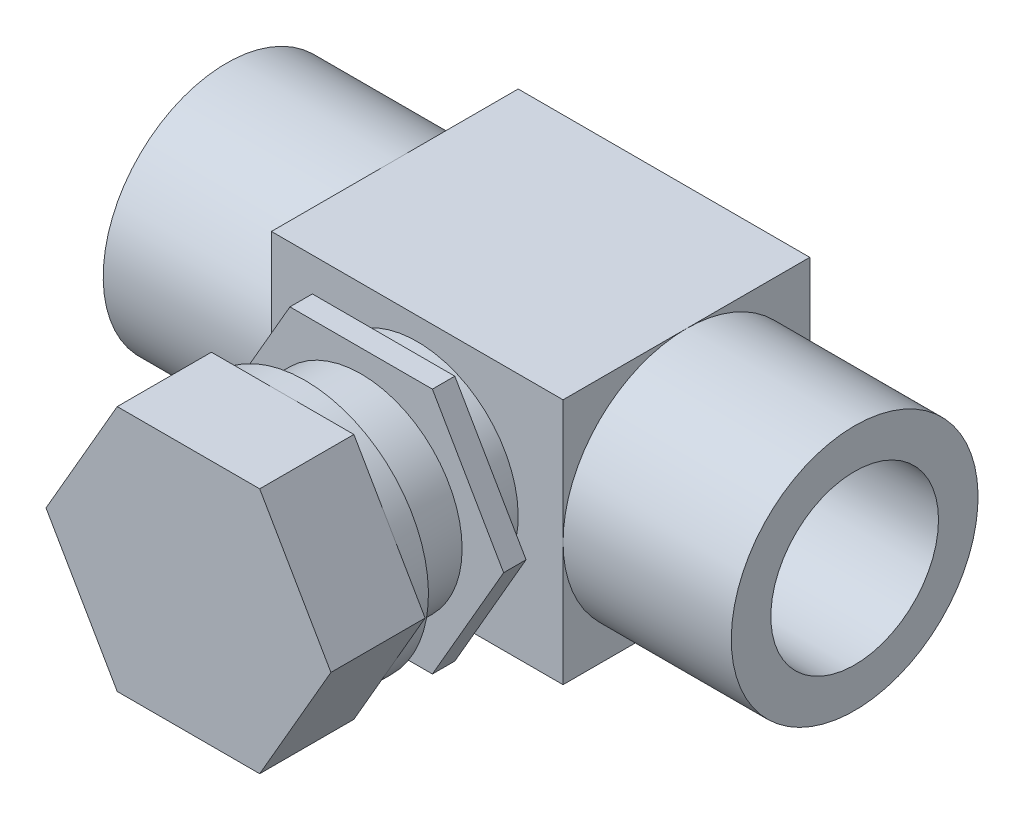
ISO-10303-21;
HEADER;
FILE_DESCRIPTION(('STEP AP214'),'2;1');
FILE_NAME('part.step','',(''),(''),'','','');
FILE_SCHEMA(('AUTOMOTIVE_DESIGN { 1 0 10303 214 1 1 1 1 }'));
ENDSEC;
DATA;
#1=APPLICATION_CONTEXT('core data for automotive mechanical design processes');
#2=APPLICATION_PROTOCOL_DEFINITION('international standard','automotive_design',2000,#1);
#3=PRODUCT_CONTEXT('',#1,'mechanical');
#4=PRODUCT('Part','Part','',(#3));
#5=PRODUCT_RELATED_PRODUCT_CATEGORY('part','',(#4));
#6=PRODUCT_DEFINITION_FORMATION('','',#4);
#7=PRODUCT_DEFINITION_CONTEXT('part definition',#1,'design');
#8=PRODUCT_DEFINITION('design','',#6,#7);
#9=PRODUCT_DEFINITION_SHAPE('','',#8);
#10=(LENGTH_UNIT() NAMED_UNIT(*) SI_UNIT(.MILLI.,.METRE.));
#11=(NAMED_UNIT(*) PLANE_ANGLE_UNIT() SI_UNIT($,.RADIAN.));
#12=(NAMED_UNIT(*) SI_UNIT($,.STERADIAN.) SOLID_ANGLE_UNIT());
#13=UNCERTAINTY_MEASURE_WITH_UNIT(LENGTH_MEASURE(1.E-05),#10,'distance_accuracy_value','');
#14=(GEOMETRIC_REPRESENTATION_CONTEXT(3) GLOBAL_UNCERTAINTY_ASSIGNED_CONTEXT((#13)) GLOBAL_UNIT_ASSIGNED_CONTEXT((#10,
#11,#12)) REPRESENTATION_CONTEXT('',''));
#15=CARTESIAN_POINT('',(0.,0.,0.));
#16=DIRECTION('',(0.,0.,1.));
#17=DIRECTION('',(1.,0.,0.));
#18=AXIS2_PLACEMENT_3D('',#15,#16,#17);
#19=CARTESIAN_POINT('',(241.042031682363,87.6716742459518,164.819588846238));
#20=DIRECTION('',(0.,0.,1.));
#21=DIRECTION('',(0.,1.,0.));
#22=AXIS2_PLACEMENT_3D('',#19,#20,#21);
#23=PLANE('',#22);
#24=CARTESIAN_POINT('',(247.392884643449,98.6716742459518,164.819588846238));
#25=DIRECTION('',(0.,0.,1.));
#26=DIRECTION('',(0.,1.,0.));
#27=AXIS2_PLACEMENT_3D('',#24,#25,#26);
#28=CIRCLE('',#27,9.);
#29=CARTESIAN_POINT('',(247.392884643449,107.671674245952,164.819588846238));
#30=VERTEX_POINT('',#29);
#31=EDGE_CURVE('E69',#30,#30,#28,.F.);
#32=ORIENTED_EDGE('',*,*,#31,.T.);
#33=EDGE_LOOP('',(#32));
#34=FACE_BOUND('',#33,.T.);
#35=DIRECTION('',(-0.5,-0.86602540378444,0.));
#36=VECTOR('',#35,1.);
#37=CARTESIAN_POINT('',(241.042031682363,109.671674245952,164.819588846238));
#38=LINE('',#37,#36);
#39=CARTESIAN_POINT('',(241.042031682363,109.671674245952,164.819588846238));
#40=VERTEX_POINT('',#39);
#41=CARTESIAN_POINT('',(234.691178721277,98.6716742459517,164.819588846238));
#42=VERTEX_POINT('',#41);
#43=EDGE_CURVE('E260',#40,#42,#38,.T.);
#44=ORIENTED_EDGE('',*,*,#43,.T.);
#45=DIRECTION('',(0.5,-0.866025403784438,0.));
#46=VECTOR('',#45,1.);
#47=CARTESIAN_POINT('',(234.691178721277,98.6716742459517,164.819588846238));
#48=LINE('',#47,#46);
#49=CARTESIAN_POINT('',(241.042031682363,87.6716742459518,164.819588846238));
#50=VERTEX_POINT('',#49);
#51=EDGE_CURVE('E262',#42,#50,#48,.T.);
#52=ORIENTED_EDGE('',*,*,#51,.T.);
#53=DIRECTION('',(1.,0.,0.));
#54=VECTOR('',#53,1.);
#55=CARTESIAN_POINT('',(241.042031682363,87.6716742459518,164.819588846238));
#56=LINE('',#55,#54);
#57=CARTESIAN_POINT('',(253.743737604535,87.6716742459518,164.819588846239));
#58=VERTEX_POINT('',#57);
#59=EDGE_CURVE('E251',#50,#58,#56,.T.);
#60=ORIENTED_EDGE('',*,*,#59,.T.);
#61=DIRECTION('',(0.5,0.866025403784439,0.));
#62=VECTOR('',#61,1.);
#63=CARTESIAN_POINT('',(253.743737604535,87.6716742459518,164.819588846239));
#64=LINE('',#63,#62);
#65=CARTESIAN_POINT('',(260.09459056562,98.6716742459518,164.819588846238));
#66=VERTEX_POINT('',#65);
#67=EDGE_CURVE('E253',#58,#66,#64,.T.);
#68=ORIENTED_EDGE('',*,*,#67,.T.);
#69=DIRECTION('',(-0.5,0.866025403784438,0.));
#70=VECTOR('',#69,1.);
#71=CARTESIAN_POINT('',(260.09459056562,98.6716742459518,164.819588846238));
#72=LINE('',#71,#70);
#73=CARTESIAN_POINT('',(253.743737604535,109.671674245952,164.819588846238));
#74=VERTEX_POINT('',#73);
#75=EDGE_CURVE('E256',#66,#74,#72,.T.);
#76=ORIENTED_EDGE('',*,*,#75,.T.);
#77=DIRECTION('',(-1.,0.,0.));
#78=VECTOR('',#77,1.);
#79=CARTESIAN_POINT('',(253.743737604535,109.671674245952,164.819588846238));
#80=LINE('',#79,#78);
#81=EDGE_CURVE('E258',#74,#40,#80,.T.);
#82=ORIENTED_EDGE('',*,*,#81,.T.);
#83=EDGE_LOOP('',(#44,#52,#60,#68,#76,#82));
#84=FACE_BOUND('',#83,.T.);
#85=ADVANCED_FACE('F61',(#34,#84),#23,.T.);
#86=CARTESIAN_POINT('',(234.392884643449,87.6716742459516,137.819588846238));
#87=DIRECTION('',(-1.,0.,0.));
#88=DIRECTION('',(0.,0.,1.));
#89=AXIS2_PLACEMENT_3D('',#86,#87,#88);
#90=PLANE('',#89);
#91=DIRECTION('',(0.,0.,-1.));
#92=VECTOR('',#91,1.);
#93=CARTESIAN_POINT('',(234.392884643449,109.671674245952,159.819588846238));
#94=LINE('',#93,#92);
#95=CARTESIAN_POINT('',(234.392884643449,109.671674245952,159.819588846238));
#96=VERTEX_POINT('',#95);
#97=CARTESIAN_POINT('',(234.392884643449,109.671674245952,148.819588846238));
#98=VERTEX_POINT('',#97);
#99=EDGE_CURVE('E320',#96,#98,#94,.T.);
#100=ORIENTED_EDGE('',*,*,#99,.T.);
#101=CARTESIAN_POINT('',(234.392884643449,98.6716742459517,148.819588846238));
#102=DIRECTION('',(1.,0.,0.));
#103=DIRECTION('',(0.,1.,0.));
#104=AXIS2_PLACEMENT_3D('',#101,#102,#103);
#105=CIRCLE('',#104,11.);
#106=CARTESIAN_POINT('',(234.392884643449,98.6716742459517,159.819588846238));
#107=VERTEX_POINT('',#106);
#108=EDGE_CURVE('E304',#98,#107,#105,.T.);
#109=ORIENTED_EDGE('',*,*,#108,.T.);
#110=DIRECTION('',(0.,1.,0.));
#111=VECTOR('',#110,1.);
#112=CARTESIAN_POINT('',(234.392884643449,87.6716742459517,159.819588846238));
#113=LINE('',#112,#111);
#114=EDGE_CURVE('E314',#107,#96,#113,.T.);
#115=ORIENTED_EDGE('',*,*,#114,.T.);
#116=EDGE_LOOP('',(#100,#109,#115));
#117=FACE_BOUND('',#116,.T.);
#118=ADVANCED_FACE('F411',(#117),#90,.T.);
#119=CARTESIAN_POINT('',(234.392884643449,87.6716742459517,159.819588846238));
#120=VERTEX_POINT('',#119);
#121=EDGE_CURVE('E316',#120,#107,#113,.T.);
#122=ORIENTED_EDGE('',*,*,#121,.T.);
#123=CARTESIAN_POINT('',(234.392884643449,87.6716742459517,148.819588846238));
#124=VERTEX_POINT('',#123);
#125=EDGE_CURVE('E309',#107,#124,#105,.T.);
#126=ORIENTED_EDGE('',*,*,#125,.T.);
#127=DIRECTION('',(0.,0.,1.));
#128=VECTOR('',#127,1.);
#129=CARTESIAN_POINT('',(234.392884643449,87.6716742459516,137.819588846238));
#130=LINE('',#129,#128);
#131=EDGE_CURVE('E315',#124,#120,#130,.T.);
#132=ORIENTED_EDGE('',*,*,#131,.T.);
#133=EDGE_LOOP('',(#122,#126,#132));
#134=FACE_BOUND('',#133,.T.);
#135=ADVANCED_FACE('F417',(#134),#90,.T.);
#136=CARTESIAN_POINT('',(234.392884643449,87.6716742459516,137.819588846238));
#137=VERTEX_POINT('',#136);
#138=EDGE_CURVE('E311',#137,#124,#130,.T.);
#139=ORIENTED_EDGE('',*,*,#138,.T.);
#140=CARTESIAN_POINT('',(234.392884643449,98.6716742459516,137.819588846238));
#141=VERTEX_POINT('',#140);
#142=EDGE_CURVE('E1294',#124,#141,#105,.T.);
#143=ORIENTED_EDGE('',*,*,#142,.T.);
#144=DIRECTION('',(0.,-1.,0.));
#145=VECTOR('',#144,1.);
#146=CARTESIAN_POINT('',(234.392884643449,109.671674245952,137.819588846238));
#147=LINE('',#146,#145);
#148=EDGE_CURVE('E323',#141,#137,#147,.T.);
#149=ORIENTED_EDGE('',*,*,#148,.T.);
#150=EDGE_LOOP('',(#139,#143,#149));
#151=FACE_BOUND('',#150,.T.);
#152=ADVANCED_FACE('F804',(#151),#90,.T.);
#153=CARTESIAN_POINT('',(234.392884643449,109.671674245952,137.819588846238));
#154=VERTEX_POINT('',#153);
#155=EDGE_CURVE('E324',#154,#141,#147,.T.);
#156=ORIENTED_EDGE('',*,*,#155,.T.);
#157=EDGE_CURVE('E310',#141,#98,#105,.T.);
#158=ORIENTED_EDGE('',*,*,#157,.T.);
#159=EDGE_CURVE('E319',#98,#154,#94,.T.);
#160=ORIENTED_EDGE('',*,*,#159,.T.);
#161=EDGE_LOOP('',(#156,#158,#160));
#162=FACE_BOUND('',#161,.T.);
#163=ADVANCED_FACE('F420',(#162),#90,.T.);
#164=CARTESIAN_POINT('',(260.392884643449,98.6716742459517,148.819588846238));
#165=DIRECTION('',(1.,0.,0.));
#166=DIRECTION('',(0.,0.,-1.));
#167=AXIS2_PLACEMENT_3D('',#164,#165,#166);
#168=CYLINDRICAL_SURFACE('',#167,11.);
#169=CARTESIAN_POINT('',(260.392884643449,98.6716742459517,148.819588846238));
#170=DIRECTION('',(1.,0.,0.));
#171=DIRECTION('',(0.,1.,0.));
#172=AXIS2_PLACEMENT_3D('',#169,#170,#171);
#173=CIRCLE('',#172,11.);
#174=CARTESIAN_POINT('',(260.392884643449,109.671674245952,148.819588846238));
#175=VERTEX_POINT('',#174);
#176=CARTESIAN_POINT('',(260.392884643449,98.6716742459517,159.819588846238));
#177=VERTEX_POINT('',#176);
#178=EDGE_CURVE('E356',#175,#177,#173,.T.);
#179=ORIENTED_EDGE('',*,*,#178,.T.);
#180=CARTESIAN_POINT('',(260.392884643449,87.6716742459517,148.819588846239));
#181=VERTEX_POINT('',#180);
#182=EDGE_CURVE('E359',#177,#181,#173,.T.);
#183=ORIENTED_EDGE('',*,*,#182,.T.);
#184=CARTESIAN_POINT('',(260.392884643449,98.6716742459516,137.819588846238));
#185=VERTEX_POINT('',#184);
#186=EDGE_CURVE('E1437',#181,#185,#173,.T.);
#187=ORIENTED_EDGE('',*,*,#186,.T.);
#188=EDGE_CURVE('E360',#185,#175,#173,.T.);
#189=ORIENTED_EDGE('',*,*,#188,.T.);
#190=EDGE_LOOP('',(#179,#183,#187,#189));
#191=FACE_BOUND('',#190,.T.);
#192=CARTESIAN_POINT('',(275.392884643449,98.6716742459517,148.819588846239));
#193=DIRECTION('',(1.,0.,0.));
#194=DIRECTION('',(0.,1.,0.));
#195=AXIS2_PLACEMENT_3D('',#192,#193,#194);
#196=CIRCLE('',#195,11.);
#197=CARTESIAN_POINT('',(275.392884643449,109.671674245952,148.819588846239));
#198=VERTEX_POINT('',#197);
#199=EDGE_CURVE('E355',#198,#198,#196,.T.);
#200=ORIENTED_EDGE('',*,*,#199,.F.);
#201=EDGE_LOOP('',(#200));
#202=FACE_BOUND('',#201,.T.);
#203=ADVANCED_FACE('F471',(#191,#202),#168,.T.);
#204=CARTESIAN_POINT('',(275.392884643449,98.6716742459517,148.819588846239));
#205=DIRECTION('',(1.,0.,0.));
#206=DIRECTION('',(0.,0.,-1.));
#207=AXIS2_PLACEMENT_3D('',#204,#205,#206);
#208=PLANE('',#207);
#209=CARTESIAN_POINT('',(275.392884643449,98.6716742459517,148.819588846239));
#210=DIRECTION('',(-1.,0.,0.));
#211=DIRECTION('',(0.,0.,-1.));
#212=AXIS2_PLACEMENT_3D('',#209,#210,#211);
#213=CIRCLE('',#212,7.475);
#214=CARTESIAN_POINT('',(275.392884643449,98.6716742459516,141.344588846239));
#215=VERTEX_POINT('',#214);
#216=EDGE_CURVE('E1422',#215,#215,#213,.T.);
#217=ORIENTED_EDGE('',*,*,#216,.T.);
#218=EDGE_LOOP('',(#217));
#219=FACE_BOUND('',#218,.T.);
#220=ORIENTED_EDGE('',*,*,#199,.T.);
#221=EDGE_LOOP('',(#220));
#222=FACE_BOUND('',#221,.T.);
#223=ADVANCED_FACE('F468',(#219,#222),#208,.T.);
#224=CARTESIAN_POINT('',(260.392884643449,87.6716742459516,137.819588846239));
#225=DIRECTION('',(-1.,0.,0.));
#226=DIRECTION('',(0.,0.,1.));
#227=AXIS2_PLACEMENT_3D('',#224,#225,#226);
#228=PLANE('',#227);
#229=ORIENTED_EDGE('',*,*,#178,.F.);
#230=DIRECTION('',(0.,0.,-1.));
#231=VECTOR('',#230,1.);
#232=CARTESIAN_POINT('',(260.392884643449,109.671674245952,148.819588846238));
#233=LINE('',#232,#231);
#234=CARTESIAN_POINT('',(260.392884643449,109.671674245952,159.819588846238));
#235=VERTEX_POINT('',#234);
#236=EDGE_CURVE('E338',#235,#175,#233,.T.);
#237=ORIENTED_EDGE('',*,*,#236,.F.);
#238=DIRECTION('',(0.,1.,0.));
#239=VECTOR('',#238,1.);
#240=CARTESIAN_POINT('',(260.392884643449,98.6716742459517,159.819588846238));
#241=LINE('',#240,#239);
#242=EDGE_CURVE('E332',#177,#235,#241,.T.);
#243=ORIENTED_EDGE('',*,*,#242,.F.);
#244=EDGE_LOOP('',(#229,#237,#243));
#245=FACE_BOUND('',#244,.T.);
#246=ADVANCED_FACE('F451',(#245),#228,.F.);
#247=ORIENTED_EDGE('',*,*,#182,.F.);
#248=CARTESIAN_POINT('',(260.392884643449,87.6716742459517,159.819588846239));
#249=VERTEX_POINT('',#248);
#250=EDGE_CURVE('E333',#249,#177,#241,.T.);
#251=ORIENTED_EDGE('',*,*,#250,.F.);
#252=DIRECTION('',(0.,0.,1.));
#253=VECTOR('',#252,1.);
#254=CARTESIAN_POINT('',(260.392884643449,87.6716742459517,148.819588846239));
#255=LINE('',#254,#253);
#256=EDGE_CURVE('E303',#181,#249,#255,.T.);
#257=ORIENTED_EDGE('',*,*,#256,.F.);
#258=EDGE_LOOP('',(#247,#251,#257));
#259=FACE_BOUND('',#258,.T.);
#260=ADVANCED_FACE('F780',(#259),#228,.F.);
#261=ORIENTED_EDGE('',*,*,#186,.F.);
#262=CARTESIAN_POINT('',(260.392884643449,87.6716742459516,137.819588846239));
#263=VERTEX_POINT('',#262);
#264=EDGE_CURVE('E328',#263,#181,#255,.T.);
#265=ORIENTED_EDGE('',*,*,#264,.F.);
#266=DIRECTION('',(0.,-1.,0.));
#267=VECTOR('',#266,1.);
#268=CARTESIAN_POINT('',(260.392884643449,109.671674245952,137.819588846238));
#269=LINE('',#268,#267);
#270=EDGE_CURVE('E341',#185,#263,#269,.T.);
#271=ORIENTED_EDGE('',*,*,#270,.F.);
#272=EDGE_LOOP('',(#261,#265,#271));
#273=FACE_BOUND('',#272,.T.);
#274=ADVANCED_FACE('F452',(#273),#228,.F.);
#275=CARTESIAN_POINT('',(234.392884643449,87.6716742459517,148.819588846238));
#276=DIRECTION('',(0.,1.,0.));
#277=DIRECTION('',(0.,0.,-1.));
#278=AXIS2_PLACEMENT_3D('',#275,#276,#277);
#279=PLANE('',#278);
#280=ORIENTED_EDGE('',*,*,#264,.T.);
#281=ORIENTED_EDGE('',*,*,#256,.T.);
#282=DIRECTION('',(1.,0.,0.));
#283=VECTOR('',#282,1.);
#284=CARTESIAN_POINT('',(234.392884643449,87.6716742459517,159.819588846238));
#285=LINE('',#284,#283);
#286=EDGE_CURVE('E350',#120,#249,#285,.T.);
#287=ORIENTED_EDGE('',*,*,#286,.F.);
#288=ORIENTED_EDGE('',*,*,#131,.F.);
#289=ORIENTED_EDGE('',*,*,#138,.F.);
#290=DIRECTION('',(1.,0.,0.));
#291=VECTOR('',#290,1.);
#292=CARTESIAN_POINT('',(234.392884643449,87.6716742459516,137.819588846238));
#293=LINE('',#292,#291);
#294=EDGE_CURVE('E352',#137,#263,#293,.T.);
#295=ORIENTED_EDGE('',*,*,#294,.T.);
#296=EDGE_LOOP('',(#280,#281,#287,#288,#289,#295));
#297=FACE_BOUND('',#296,.T.);
#298=ADVANCED_FACE('F463',(#297),#279,.F.);
#299=CARTESIAN_POINT('',(234.392884643449,98.6716742459517,159.819588846238));
#300=DIRECTION('',(0.,0.,-1.));
#301=DIRECTION('',(0.,-1.,0.));
#302=AXIS2_PLACEMENT_3D('',#299,#300,#301);
#303=PLANE('',#302);
#304=CARTESIAN_POINT('',(247.392884643449,98.6716742459517,159.819588846238));
#305=DIRECTION('',(0.,0.,-1.));
#306=DIRECTION('',(0.,-1.,0.));
#307=AXIS2_PLACEMENT_3D('',#304,#305,#306);
#308=CIRCLE('',#307,9.);
#309=CARTESIAN_POINT('',(247.392884643449,89.6716742459517,159.819588846238));
#310=VERTEX_POINT('',#309);
#311=EDGE_CURVE('E299',#310,#310,#308,.T.);
#312=ORIENTED_EDGE('',*,*,#311,.T.);
#313=EDGE_LOOP('',(#312));
#314=FACE_BOUND('',#313,.T.);
#315=ORIENTED_EDGE('',*,*,#242,.T.);
#316=DIRECTION('',(1.,0.,0.));
#317=VECTOR('',#316,1.);
#318=CARTESIAN_POINT('',(234.392884643449,109.671674245952,159.819588846238));
#319=LINE('',#318,#317);
#320=EDGE_CURVE('E348',#96,#235,#319,.T.);
#321=ORIENTED_EDGE('',*,*,#320,.F.);
#322=ORIENTED_EDGE('',*,*,#114,.F.);
#323=ORIENTED_EDGE('',*,*,#121,.F.);
#324=ORIENTED_EDGE('',*,*,#286,.T.);
#325=ORIENTED_EDGE('',*,*,#250,.T.);
#326=EDGE_LOOP('',(#315,#321,#322,#323,#324,#325));
#327=FACE_BOUND('',#326,.T.);
#328=ADVANCED_FACE('F459',(#314,#327),#303,.F.);
#329=CARTESIAN_POINT('',(234.392884643449,109.671674245952,148.819588846238));
#330=DIRECTION('',(0.,-1.,0.));
#331=DIRECTION('',(0.,0.,1.));
#332=AXIS2_PLACEMENT_3D('',#329,#330,#331);
#333=PLANE('',#332);
#334=ORIENTED_EDGE('',*,*,#236,.T.);
#335=CARTESIAN_POINT('',(260.392884643449,109.671674245952,137.819588846238));
#336=VERTEX_POINT('',#335);
#337=EDGE_CURVE('E337',#175,#336,#233,.T.);
#338=ORIENTED_EDGE('',*,*,#337,.T.);
#339=DIRECTION('',(1.,0.,0.));
#340=VECTOR('',#339,1.);
#341=CARTESIAN_POINT('',(234.392884643449,109.671674245952,137.819588846238));
#342=LINE('',#341,#340);
#343=EDGE_CURVE('E327',#154,#336,#342,.T.);
#344=ORIENTED_EDGE('',*,*,#343,.F.);
#345=ORIENTED_EDGE('',*,*,#159,.F.);
#346=ORIENTED_EDGE('',*,*,#99,.F.);
#347=ORIENTED_EDGE('',*,*,#320,.T.);
#348=EDGE_LOOP('',(#334,#338,#344,#345,#346,#347));
#349=FACE_BOUND('',#348,.T.);
#350=ADVANCED_FACE('F455',(#349),#333,.F.);
#351=CARTESIAN_POINT('',(234.392884643449,109.671674245952,137.819588846238));
#352=DIRECTION('',(0.,0.,1.));
#353=DIRECTION('',(0.,1.,0.));
#354=AXIS2_PLACEMENT_3D('',#351,#352,#353);
#355=PLANE('',#354);
#356=EDGE_CURVE('E342',#336,#185,#269,.T.);
#357=ORIENTED_EDGE('',*,*,#356,.T.);
#358=ORIENTED_EDGE('',*,*,#270,.T.);
#359=ORIENTED_EDGE('',*,*,#294,.F.);
#360=ORIENTED_EDGE('',*,*,#148,.F.);
#361=ORIENTED_EDGE('',*,*,#155,.F.);
#362=ORIENTED_EDGE('',*,*,#343,.T.);
#363=EDGE_LOOP('',(#357,#358,#359,#360,#361,#362));
#364=FACE_BOUND('',#363,.T.);
#365=ADVANCED_FACE('F449',(#364),#355,.F.);
#366=ORIENTED_EDGE('',*,*,#188,.F.);
#367=ORIENTED_EDGE('',*,*,#356,.F.);
#368=ORIENTED_EDGE('',*,*,#337,.F.);
#369=EDGE_LOOP('',(#366,#367,#368));
#370=FACE_BOUND('',#369,.T.);
#371=ADVANCED_FACE('F444',(#370),#228,.F.);
#372=CARTESIAN_POINT('',(219.392884643449,98.6716742459517,148.819588846238));
#373=DIRECTION('',(1.,0.,0.));
#374=DIRECTION('',(0.,0.,-1.));
#375=AXIS2_PLACEMENT_3D('',#372,#373,#374);
#376=CYLINDRICAL_SURFACE('',#375,11.);
#377=ORIENTED_EDGE('',*,*,#108,.F.);
#378=ORIENTED_EDGE('',*,*,#157,.F.);
#379=ORIENTED_EDGE('',*,*,#142,.F.);
#380=ORIENTED_EDGE('',*,*,#125,.F.);
#381=EDGE_LOOP('',(#377,#378,#379,#380));
#382=FACE_BOUND('',#381,.T.);
#383=CARTESIAN_POINT('',(219.392884643449,98.6716742459517,148.819588846238));
#384=DIRECTION('',(1.,0.,0.));
#385=DIRECTION('',(0.,-1.,0.));
#386=AXIS2_PLACEMENT_3D('',#383,#384,#385);
#387=CIRCLE('',#386,11.);
#388=CARTESIAN_POINT('',(219.392884643449,87.6716742459517,148.819588846238));
#389=VERTEX_POINT('',#388);
#390=EDGE_CURVE('E300',#389,#389,#387,.T.);
#391=ORIENTED_EDGE('',*,*,#390,.T.);
#392=EDGE_LOOP('',(#391));
#393=FACE_BOUND('',#392,.T.);
#394=ADVANCED_FACE('F441',(#382,#393),#376,.T.);
#395=CARTESIAN_POINT('',(219.392884643449,98.6716742459517,148.819588846238));
#396=DIRECTION('',(1.,0.,0.));
#397=DIRECTION('',(0.,0.,-1.));
#398=AXIS2_PLACEMENT_3D('',#395,#396,#397);
#399=PLANE('',#398);
#400=CARTESIAN_POINT('',(219.392884643449,98.6716742459517,148.819588846238));
#401=DIRECTION('',(1.,0.,0.));
#402=DIRECTION('',(0.,0.,1.));
#403=AXIS2_PLACEMENT_3D('',#400,#401,#402);
#404=CIRCLE('',#403,7.475);
#405=CARTESIAN_POINT('',(219.392884643449,98.6716742459517,156.294588846238));
#406=VERTEX_POINT('',#405);
#407=EDGE_CURVE('E228',#406,#406,#404,.T.);
#408=ORIENTED_EDGE('',*,*,#407,.T.);
#409=EDGE_LOOP('',(#408));
#410=FACE_BOUND('',#409,.T.);
#411=ORIENTED_EDGE('',*,*,#390,.F.);
#412=EDGE_LOOP('',(#411));
#413=FACE_BOUND('',#412,.T.);
#414=ADVANCED_FACE('F438',(#410,#413),#399,.F.);
#415=CARTESIAN_POINT('',(247.392884643449,98.6716742459518,160.819588846238));
#416=DIRECTION('',(0.,0.,-1.));
#417=DIRECTION('',(0.,-1.,0.));
#418=AXIS2_PLACEMENT_3D('',#415,#416,#417);
#419=CYLINDRICAL_SURFACE('',#418,9.);
#420=ORIENTED_EDGE('',*,*,#311,.F.);
#421=EDGE_LOOP('',(#420));
#422=FACE_BOUND('',#421,.T.);
#423=CARTESIAN_POINT('',(247.392884643449,98.6716742459518,162.819588846238));
#424=DIRECTION('',(0.,0.,1.));
#425=DIRECTION('',(0.,1.,0.));
#426=AXIS2_PLACEMENT_3D('',#423,#424,#425);
#427=CIRCLE('',#426,9.);
#428=CARTESIAN_POINT('',(247.392884643449,107.671674245952,162.819588846238));
#429=VERTEX_POINT('',#428);
#430=EDGE_CURVE('E308',#429,#429,#427,.F.);
#431=ORIENTED_EDGE('',*,*,#430,.T.);
#432=EDGE_LOOP('',(#431));
#433=FACE_BOUND('',#432,.T.);
#434=ADVANCED_FACE('F63',(#422,#433),#419,.T.);
#435=CARTESIAN_POINT('',(241.042031682363,87.6716742459518,162.819588846238));
#436=DIRECTION('',(0.,0.,1.));
#437=DIRECTION('',(0.,1.,0.));
#438=AXIS2_PLACEMENT_3D('',#435,#436,#437);
#439=PLANE('',#438);
#440=ORIENTED_EDGE('',*,*,#430,.F.);
#441=EDGE_LOOP('',(#440));
#442=FACE_BOUND('',#441,.T.);
#443=DIRECTION('',(0.5,-0.866025403784438,0.));
#444=VECTOR('',#443,1.);
#445=CARTESIAN_POINT('',(234.691178721277,98.6716742459517,162.819588846238));
#446=LINE('',#445,#444);
#447=CARTESIAN_POINT('',(234.691178721277,98.6716742459517,162.819588846238));
#448=VERTEX_POINT('',#447);
#449=CARTESIAN_POINT('',(241.042031682363,87.6716742459518,162.819588846238));
#450=VERTEX_POINT('',#449);
#451=EDGE_CURVE('E254',#448,#450,#446,.T.);
#452=ORIENTED_EDGE('',*,*,#451,.F.);
#453=DIRECTION('',(-0.5,-0.866025403784439,0.));
#454=VECTOR('',#453,1.);
#455=CARTESIAN_POINT('',(237.86660520182,104.171674245952,162.819588846238));
#456=LINE('',#455,#454);
#457=CARTESIAN_POINT('',(241.042031682363,109.671674245952,162.819588846238));
#458=VERTEX_POINT('',#457);
#459=EDGE_CURVE('E277',#458,#448,#456,.T.);
#460=ORIENTED_EDGE('',*,*,#459,.F.);
#461=DIRECTION('',(-1.,0.,0.));
#462=VECTOR('',#461,1.);
#463=CARTESIAN_POINT('',(247.392884643449,109.671674245952,162.819588846238));
#464=LINE('',#463,#462);
#465=CARTESIAN_POINT('',(253.743737604535,109.671674245952,162.819588846238));
#466=VERTEX_POINT('',#465);
#467=EDGE_CURVE('E274',#466,#458,#464,.T.);
#468=ORIENTED_EDGE('',*,*,#467,.F.);
#469=DIRECTION('',(-0.5,0.866025403784438,0.));
#470=VECTOR('',#469,1.);
#471=CARTESIAN_POINT('',(256.919164085077,104.171674245952,162.819588846238));
#472=LINE('',#471,#470);
#473=CARTESIAN_POINT('',(260.09459056562,98.6716742459518,162.819588846238));
#474=VERTEX_POINT('',#473);
#475=EDGE_CURVE('E271',#474,#466,#472,.T.);
#476=ORIENTED_EDGE('',*,*,#475,.F.);
#477=DIRECTION('',(0.5,0.866025403784439,0.));
#478=VECTOR('',#477,1.);
#479=CARTESIAN_POINT('',(256.919164085077,93.1716742459518,162.819588846238));
#480=LINE('',#479,#478);
#481=CARTESIAN_POINT('',(253.743737604535,87.6716742459518,162.819588846239));
#482=VERTEX_POINT('',#481);
#483=EDGE_CURVE('E268',#482,#474,#480,.T.);
#484=ORIENTED_EDGE('',*,*,#483,.F.);
#485=DIRECTION('',(1.,0.,0.));
#486=VECTOR('',#485,1.);
#487=CARTESIAN_POINT('',(247.392884643449,87.6716742459518,162.819588846238));
#488=LINE('',#487,#486);
#489=EDGE_CURVE('E265',#450,#482,#488,.T.);
#490=ORIENTED_EDGE('',*,*,#489,.F.);
#491=EDGE_LOOP('',(#452,#460,#468,#476,#484,#490));
#492=FACE_BOUND('',#491,.T.);
#493=ADVANCED_FACE('F375',(#442,#492),#439,.F.);
#494=CARTESIAN_POINT('',(247.392884643449,87.6716742459518,164.819588846238));
#495=DIRECTION('',(0.,1.,0.));
#496=DIRECTION('',(-1.,0.,0.));
#497=AXIS2_PLACEMENT_3D('',#494,#495,#496);
#498=PLANE('',#497);
#499=ORIENTED_EDGE('',*,*,#489,.T.);
#500=DIRECTION('',(0.,0.,-1.));
#501=VECTOR('',#500,1.);
#502=CARTESIAN_POINT('',(253.743737604535,87.6716742459518,164.819588846239));
#503=LINE('',#502,#501);
#504=EDGE_CURVE('E293',#58,#482,#503,.T.);
#505=ORIENTED_EDGE('',*,*,#504,.F.);
#506=ORIENTED_EDGE('',*,*,#59,.F.);
#507=DIRECTION('',(0.,0.,-1.));
#508=VECTOR('',#507,1.);
#509=CARTESIAN_POINT('',(241.042031682363,87.6716742459518,164.819588846238));
#510=LINE('',#509,#508);
#511=EDGE_CURVE('E296',#50,#450,#510,.T.);
#512=ORIENTED_EDGE('',*,*,#511,.T.);
#513=EDGE_LOOP('',(#499,#505,#506,#512));
#514=FACE_BOUND('',#513,.T.);
#515=ADVANCED_FACE('F378',(#514),#498,.F.);
#516=CARTESIAN_POINT('',(256.919164085077,93.1716742459518,164.819588846238));
#517=DIRECTION('',(-0.866025403784439,0.5,0.));
#518=DIRECTION('',(-0.5,-0.866025403784439,0.));
#519=AXIS2_PLACEMENT_3D('',#516,#517,#518);
#520=PLANE('',#519);
#521=ORIENTED_EDGE('',*,*,#483,.T.);
#522=DIRECTION('',(0.,0.,-1.));
#523=VECTOR('',#522,1.);
#524=CARTESIAN_POINT('',(260.09459056562,98.6716742459518,164.819588846238));
#525=LINE('',#524,#523);
#526=EDGE_CURVE('E290',#66,#474,#525,.T.);
#527=ORIENTED_EDGE('',*,*,#526,.F.);
#528=ORIENTED_EDGE('',*,*,#67,.F.);
#529=ORIENTED_EDGE('',*,*,#504,.T.);
#530=EDGE_LOOP('',(#521,#527,#528,#529));
#531=FACE_BOUND('',#530,.T.);
#532=ADVANCED_FACE('F405',(#531),#520,.F.);
#533=CARTESIAN_POINT('',(256.919164085077,104.171674245952,164.819588846238));
#534=DIRECTION('',(-0.866025403784438,-0.5,0.));
#535=DIRECTION('',(0.5,-0.866025403784438,0.));
#536=AXIS2_PLACEMENT_3D('',#533,#534,#535);
#537=PLANE('',#536);
#538=ORIENTED_EDGE('',*,*,#475,.T.);
#539=DIRECTION('',(0.,0.,-1.));
#540=VECTOR('',#539,1.);
#541=CARTESIAN_POINT('',(253.743737604535,109.671674245952,164.819588846238));
#542=LINE('',#541,#540);
#543=EDGE_CURVE('E287',#74,#466,#542,.T.);
#544=ORIENTED_EDGE('',*,*,#543,.F.);
#545=ORIENTED_EDGE('',*,*,#75,.F.);
#546=ORIENTED_EDGE('',*,*,#526,.T.);
#547=EDGE_LOOP('',(#538,#544,#545,#546));
#548=FACE_BOUND('',#547,.T.);
#549=ADVANCED_FACE('F402',(#548),#537,.F.);
#550=CARTESIAN_POINT('',(247.392884643449,109.671674245952,164.819588846238));
#551=DIRECTION('',(0.,-1.,0.));
#552=DIRECTION('',(1.,0.,0.));
#553=AXIS2_PLACEMENT_3D('',#550,#551,#552);
#554=PLANE('',#553);
#555=ORIENTED_EDGE('',*,*,#467,.T.);
#556=DIRECTION('',(0.,0.,-1.));
#557=VECTOR('',#556,1.);
#558=CARTESIAN_POINT('',(241.042031682363,109.671674245952,164.819588846238));
#559=LINE('',#558,#557);
#560=EDGE_CURVE('E284',#40,#458,#559,.T.);
#561=ORIENTED_EDGE('',*,*,#560,.F.);
#562=ORIENTED_EDGE('',*,*,#81,.F.);
#563=ORIENTED_EDGE('',*,*,#543,.T.);
#564=EDGE_LOOP('',(#555,#561,#562,#563));
#565=FACE_BOUND('',#564,.T.);
#566=ADVANCED_FACE('F396',(#565),#554,.F.);
#567=CARTESIAN_POINT('',(237.86660520182,104.171674245952,164.819588846238));
#568=DIRECTION('',(0.866025403784439,-0.5,0.));
#569=DIRECTION('',(0.5,0.866025403784439,0.));
#570=AXIS2_PLACEMENT_3D('',#567,#568,#569);
#571=PLANE('',#570);
#572=ORIENTED_EDGE('',*,*,#459,.T.);
#573=DIRECTION('',(0.,0.,-1.));
#574=VECTOR('',#573,1.);
#575=CARTESIAN_POINT('',(234.691178721277,98.6716742459517,164.819588846238));
#576=LINE('',#575,#574);
#577=EDGE_CURVE('E264',#42,#448,#576,.T.);
#578=ORIENTED_EDGE('',*,*,#577,.F.);
#579=ORIENTED_EDGE('',*,*,#43,.F.);
#580=ORIENTED_EDGE('',*,*,#560,.T.);
#581=EDGE_LOOP('',(#572,#578,#579,#580));
#582=FACE_BOUND('',#581,.T.);
#583=ADVANCED_FACE('F392',(#582),#571,.F.);
#584=CARTESIAN_POINT('',(234.691178721277,98.6716742459517,164.819588846238));
#585=DIRECTION('',(0.866025403784438,0.5,0.));
#586=DIRECTION('',(-0.5,0.866025403784438,0.));
#587=AXIS2_PLACEMENT_3D('',#584,#585,#586);
#588=PLANE('',#587);
#589=ORIENTED_EDGE('',*,*,#451,.T.);
#590=ORIENTED_EDGE('',*,*,#511,.F.);
#591=ORIENTED_EDGE('',*,*,#51,.F.);
#592=ORIENTED_EDGE('',*,*,#577,.T.);
#593=EDGE_LOOP('',(#589,#590,#591,#592));
#594=FACE_BOUND('',#593,.T.);
#595=ADVANCED_FACE('F387',(#594),#588,.F.);
#596=CARTESIAN_POINT('',(247.392884643449,98.6716742459519,169.819588846238));
#597=DIRECTION('',(0.,0.,-1.));
#598=DIRECTION('',(0.,-1.,0.));
#599=AXIS2_PLACEMENT_3D('',#596,#597,#598);
#600=CYLINDRICAL_SURFACE('',#599,9.);
#601=ORIENTED_EDGE('',*,*,#31,.F.);
#602=EDGE_LOOP('',(#601));
#603=FACE_BOUND('',#602,.T.);
#604=CARTESIAN_POINT('',(247.392884643449,98.6716742459519,169.819588846238));
#605=DIRECTION('',(0.,0.,-1.));
#606=DIRECTION('',(0.,-1.,0.));
#607=AXIS2_PLACEMENT_3D('',#604,#605,#606);
#608=CIRCLE('',#607,9.);
#609=CARTESIAN_POINT('',(247.392884643449,89.6716742459519,169.819588846238));
#610=VERTEX_POINT('',#609);
#611=EDGE_CURVE('E248',#610,#610,#608,.F.);
#612=ORIENTED_EDGE('',*,*,#611,.F.);
#613=EDGE_LOOP('',(#612));
#614=FACE_BOUND('',#613,.T.);
#615=ADVANCED_FACE('F427',(#603,#614),#600,.T.);
#616=CARTESIAN_POINT('',(247.392884643449,98.6716742459519,171.819588846238));
#617=DIRECTION('',(0.,0.,-1.));
#618=DIRECTION('',(0.,-1.,0.));
#619=AXIS2_PLACEMENT_3D('',#616,#617,#618);
#620=CYLINDRICAL_SURFACE('',#619,11.);
#621=CARTESIAN_POINT('',(247.392884643449,98.6716742459519,171.819588846238));
#622=DIRECTION('',(0.,0.,-1.));
#623=DIRECTION('',(0.,1.,0.));
#624=AXIS2_PLACEMENT_3D('',#621,#622,#623);
#625=CIRCLE('',#624,11.);
#626=CARTESIAN_POINT('',(247.392884643449,109.671674245952,171.819588846238));
#627=VERTEX_POINT('',#626);
#628=CARTESIAN_POINT('',(256.919164085077,104.171674245952,171.819588846238));
#629=VERTEX_POINT('',#628);
#630=EDGE_CURVE('E246',#627,#629,#625,.T.);
#631=ORIENTED_EDGE('',*,*,#630,.T.);
#632=CARTESIAN_POINT('',(256.919164085077,93.1716742459518,171.819588846239));
#633=VERTEX_POINT('',#632);
#634=EDGE_CURVE('E249',#629,#633,#625,.T.);
#635=ORIENTED_EDGE('',*,*,#634,.T.);
#636=CARTESIAN_POINT('',(247.392884643449,87.6716742459518,171.819588846238));
#637=VERTEX_POINT('',#636);
#638=EDGE_CURVE('E1403',#633,#637,#625,.T.);
#639=ORIENTED_EDGE('',*,*,#638,.T.);
#640=CARTESIAN_POINT('',(237.86660520182,93.1716742459518,171.819588846238));
#641=VERTEX_POINT('',#640);
#642=EDGE_CURVE('E1402',#637,#641,#625,.T.);
#643=ORIENTED_EDGE('',*,*,#642,.T.);
#644=CARTESIAN_POINT('',(237.86660520182,104.171674245952,171.819588846238));
#645=VERTEX_POINT('',#644);
#646=EDGE_CURVE('E1399',#641,#645,#625,.T.);
#647=ORIENTED_EDGE('',*,*,#646,.T.);
#648=EDGE_CURVE('E240',#645,#627,#625,.T.);
#649=ORIENTED_EDGE('',*,*,#648,.T.);
#650=EDGE_LOOP('',(#631,#635,#639,#643,#647,#649));
#651=FACE_BOUND('',#650,.T.);
#652=CARTESIAN_POINT('',(247.392884643449,98.6716742459519,169.819588846238));
#653=DIRECTION('',(0.,0.,-1.));
#654=DIRECTION('',(0.,1.,0.));
#655=AXIS2_PLACEMENT_3D('',#652,#653,#654);
#656=CIRCLE('',#655,11.);
#657=CARTESIAN_POINT('',(247.392884643449,109.671674245952,169.819588846238));
#658=VERTEX_POINT('',#657);
#659=EDGE_CURVE('E236',#658,#658,#656,.T.);
#660=ORIENTED_EDGE('',*,*,#659,.F.);
#661=EDGE_LOOP('',(#660));
#662=FACE_BOUND('',#661,.T.);
#663=ADVANCED_FACE('F422',(#651,#662),#620,.T.);
#664=CARTESIAN_POINT('',(247.392884643449,98.6716742459519,169.819588846238));
#665=DIRECTION('',(0.,0.,-1.));
#666=DIRECTION('',(0.,-1.,0.));
#667=AXIS2_PLACEMENT_3D('',#664,#665,#666);
#668=PLANE('',#667);
#669=ORIENTED_EDGE('',*,*,#611,.T.);
#670=EDGE_LOOP('',(#669));
#671=FACE_BOUND('',#670,.T.);
#672=ORIENTED_EDGE('',*,*,#659,.T.);
#673=EDGE_LOOP('',(#672));
#674=FACE_BOUND('',#673,.T.);
#675=ADVANCED_FACE('F480',(#671,#674),#668,.T.);
#676=CARTESIAN_POINT('',(253.743737604534,87.6716742459518,171.819588846239));
#677=DIRECTION('',(0.,0.,1.));
#678=DIRECTION('',(0.,1.,0.));
#679=AXIS2_PLACEMENT_3D('',#676,#677,#678);
#680=PLANE('',#679);
#681=ORIENTED_EDGE('',*,*,#630,.F.);
#682=DIRECTION('',(-1.,0.,0.));
#683=VECTOR('',#682,1.);
#684=CARTESIAN_POINT('',(247.392884643449,109.671674245952,171.819588846238));
#685=LINE('',#684,#683);
#686=CARTESIAN_POINT('',(253.743737604534,109.671674245952,171.819588846238));
#687=VERTEX_POINT('',#686);
#688=EDGE_CURVE('E83',#687,#627,#685,.T.);
#689=ORIENTED_EDGE('',*,*,#688,.F.);
#690=DIRECTION('',(-0.5,0.866025403784437,0.));
#691=VECTOR('',#690,1.);
#692=CARTESIAN_POINT('',(256.919164085077,104.171674245952,171.819588846238));
#693=LINE('',#692,#691);
#694=EDGE_CURVE('E1339',#629,#687,#693,.T.);
#695=ORIENTED_EDGE('',*,*,#694,.F.);
#696=EDGE_LOOP('',(#681,#689,#695));
#697=FACE_BOUND('',#696,.T.);
#698=ADVANCED_FACE('F488',(#697),#680,.F.);
#699=ORIENTED_EDGE('',*,*,#634,.F.);
#700=CARTESIAN_POINT('',(260.09459056562,98.6716742459519,171.819588846238));
#701=VERTEX_POINT('',#700);
#702=EDGE_CURVE('E1345',#701,#629,#693,.T.);
#703=ORIENTED_EDGE('',*,*,#702,.F.);
#704=DIRECTION('',(0.5,0.86602540378444,0.));
#705=VECTOR('',#704,1.);
#706=CARTESIAN_POINT('',(256.919164085077,93.1716742459518,171.819588846239));
#707=LINE('',#706,#705);
#708=EDGE_CURVE('E1340',#633,#701,#707,.T.);
#709=ORIENTED_EDGE('',*,*,#708,.F.);
#710=EDGE_LOOP('',(#699,#703,#709));
#711=FACE_BOUND('',#710,.T.);
#712=ADVANCED_FACE('F494',(#711),#680,.F.);
#713=ORIENTED_EDGE('',*,*,#638,.F.);
#714=CARTESIAN_POINT('',(253.743737604534,87.6716742459518,171.819588846239));
#715=VERTEX_POINT('',#714);
#716=EDGE_CURVE('E1336',#715,#633,#707,.T.);
#717=ORIENTED_EDGE('',*,*,#716,.F.);
#718=DIRECTION('',(1.,0.,0.));
#719=VECTOR('',#718,1.);
#720=CARTESIAN_POINT('',(241.042031682363,87.6716742459518,171.819588846238));
#721=LINE('',#720,#719);
#722=EDGE_CURVE('E234',#637,#715,#721,.T.);
#723=ORIENTED_EDGE('',*,*,#722,.F.);
#724=EDGE_LOOP('',(#713,#717,#723));
#725=FACE_BOUND('',#724,.T.);
#726=ADVANCED_FACE('F598',(#725),#680,.F.);
#727=ORIENTED_EDGE('',*,*,#642,.F.);
#728=CARTESIAN_POINT('',(241.042031682363,87.6716742459518,171.819588846238));
#729=VERTEX_POINT('',#728);
#730=EDGE_CURVE('E1377',#729,#637,#721,.T.);
#731=ORIENTED_EDGE('',*,*,#730,.F.);
#732=DIRECTION('',(0.5,-0.866025403784438,0.));
#733=VECTOR('',#732,1.);
#734=CARTESIAN_POINT('',(237.86660520182,93.1716742459518,171.819588846238));
#735=LINE('',#734,#733);
#736=EDGE_CURVE('E1364',#641,#729,#735,.T.);
#737=ORIENTED_EDGE('',*,*,#736,.F.);
#738=EDGE_LOOP('',(#727,#731,#737));
#739=FACE_BOUND('',#738,.T.);
#740=ADVANCED_FACE('F591',(#739),#680,.F.);
#741=ORIENTED_EDGE('',*,*,#646,.F.);
#742=CARTESIAN_POINT('',(234.691178721277,98.6716742459519,171.819588846238));
#743=VERTEX_POINT('',#742);
#744=EDGE_CURVE('E1369',#743,#641,#735,.T.);
#745=ORIENTED_EDGE('',*,*,#744,.F.);
#746=DIRECTION('',(-0.5,-0.866025403784439,0.));
#747=VECTOR('',#746,1.);
#748=CARTESIAN_POINT('',(237.86660520182,104.171674245952,171.819588846238));
#749=LINE('',#748,#747);
#750=EDGE_CURVE('E1356',#645,#743,#749,.T.);
#751=ORIENTED_EDGE('',*,*,#750,.F.);
#752=EDGE_LOOP('',(#741,#745,#751));
#753=FACE_BOUND('',#752,.T.);
#754=ADVANCED_FACE('F502',(#753),#680,.F.);
#755=CARTESIAN_POINT('',(256.919164085077,93.1716742459519,180.819588846238));
#756=DIRECTION('',(-0.86602540378444,0.5,0.));
#757=DIRECTION('',(-0.5,-0.86602540378444,0.));
#758=AXIS2_PLACEMENT_3D('',#755,#756,#757);
#759=PLANE('',#758);
#760=DIRECTION('',(0.,0.,-1.));
#761=VECTOR('',#760,1.);
#762=CARTESIAN_POINT('',(260.09459056562,98.671674245952,180.819588846238));
#763=LINE('',#762,#761);
#764=CARTESIAN_POINT('',(260.09459056562,98.671674245952,180.217225364224));
#765=VERTEX_POINT('',#764);
#766=EDGE_CURVE('E227',#765,#701,#763,.T.);
#767=ORIENTED_EDGE('',*,*,#766,.F.);
#768=DIRECTION('',(-0.499999999999999,-0.866025403784439,0.));
#769=VECTOR('',#768,1.);
#770=CARTESIAN_POINT('',(256.919164085077,93.1716742459519,180.217225364224));
#771=LINE('',#770,#769);
#772=CARTESIAN_POINT('',(253.743737604534,87.6716742459519,180.217225364224));
#773=VERTEX_POINT('',#772);
#774=EDGE_CURVE('E215',#765,#773,#771,.T.);
#775=ORIENTED_EDGE('',*,*,#774,.T.);
#776=DIRECTION('',(0.,0.,-1.));
#777=VECTOR('',#776,1.);
#778=CARTESIAN_POINT('',(253.743737604534,87.6716742459519,180.819588846239));
#779=LINE('',#778,#777);
#780=EDGE_CURVE('E224',#773,#715,#779,.T.);
#781=ORIENTED_EDGE('',*,*,#780,.T.);
#782=ORIENTED_EDGE('',*,*,#716,.T.);
#783=ORIENTED_EDGE('',*,*,#708,.T.);
#784=EDGE_LOOP('',(#767,#775,#781,#782,#783));
#785=FACE_BOUND('',#784,.T.);
#786=ADVANCED_FACE('F222',(#785),#759,.F.);
#787=CARTESIAN_POINT('',(256.919164085077,104.171674245952,180.819588846238));
#788=DIRECTION('',(-0.866025403784437,-0.5,0.));
#789=DIRECTION('',(0.5,-0.866025403784437,0.));
#790=AXIS2_PLACEMENT_3D('',#787,#788,#789);
#791=PLANE('',#790);
#792=DIRECTION('',(0.,0.,-1.));
#793=VECTOR('',#792,1.);
#794=CARTESIAN_POINT('',(253.743737604534,109.671674245952,180.819588846238));
#795=LINE('',#794,#793);
#796=CARTESIAN_POINT('',(253.743737604534,109.671674245952,180.217225364224));
#797=VERTEX_POINT('',#796);
#798=EDGE_CURVE('E242',#797,#687,#795,.T.);
#799=ORIENTED_EDGE('',*,*,#798,.F.);
#800=DIRECTION('',(0.500000000000001,-0.866025403784438,0.));
#801=VECTOR('',#800,1.);
#802=CARTESIAN_POINT('',(256.919164085077,104.171674245952,180.217225364224));
#803=LINE('',#802,#801);
#804=EDGE_CURVE('E229',#797,#765,#803,.T.);
#805=ORIENTED_EDGE('',*,*,#804,.T.);
#806=ORIENTED_EDGE('',*,*,#766,.T.);
#807=ORIENTED_EDGE('',*,*,#702,.T.);
#808=ORIENTED_EDGE('',*,*,#694,.T.);
#809=EDGE_LOOP('',(#799,#805,#806,#807,#808));
#810=FACE_BOUND('',#809,.T.);
#811=ADVANCED_FACE('F501',(#810),#791,.F.);
#812=CARTESIAN_POINT('',(247.392884643448,109.671674245952,180.819588846238));
#813=DIRECTION('',(0.,-1.,0.));
#814=DIRECTION('',(1.,0.,0.));
#815=AXIS2_PLACEMENT_3D('',#812,#813,#814);
#816=PLANE('',#815);
#817=DIRECTION('',(0.,0.,-1.));
#818=VECTOR('',#817,1.);
#819=CARTESIAN_POINT('',(241.042031682363,109.671674245952,180.819588846238));
#820=LINE('',#819,#818);
#821=CARTESIAN_POINT('',(241.042031682363,109.671674245952,180.217225364224));
#822=VERTEX_POINT('',#821);
#823=CARTESIAN_POINT('',(241.042031682363,109.671674245952,171.819588846238));
#824=VERTEX_POINT('',#823);
#825=EDGE_CURVE('E1387',#822,#824,#820,.T.);
#826=ORIENTED_EDGE('',*,*,#825,.F.);
#827=DIRECTION('',(1.,0.,0.));
#828=VECTOR('',#827,1.);
#829=CARTESIAN_POINT('',(247.392884643448,109.671674245952,180.217225364224));
#830=LINE('',#829,#828);
#831=EDGE_CURVE('E1391',#822,#797,#830,.T.);
#832=ORIENTED_EDGE('',*,*,#831,.T.);
#833=ORIENTED_EDGE('',*,*,#798,.T.);
#834=ORIENTED_EDGE('',*,*,#688,.T.);
#835=EDGE_CURVE('E1349',#627,#824,#685,.T.);
#836=ORIENTED_EDGE('',*,*,#835,.T.);
#837=EDGE_LOOP('',(#826,#832,#833,#834,#836));
#838=FACE_BOUND('',#837,.T.);
#839=ADVANCED_FACE('F505',(#838),#816,.F.);
#840=CARTESIAN_POINT('',(237.86660520182,104.171674245952,180.819588846238));
#841=DIRECTION('',(0.866025403784439,-0.5,0.));
#842=DIRECTION('',(0.5,0.866025403784439,0.));
#843=AXIS2_PLACEMENT_3D('',#840,#841,#842);
#844=PLANE('',#843);
#845=DIRECTION('',(0.,0.,-1.));
#846=VECTOR('',#845,1.);
#847=CARTESIAN_POINT('',(234.691178721277,98.6716742459519,180.819588846238));
#848=LINE('',#847,#846);
#849=CARTESIAN_POINT('',(234.691178721277,98.6716742459519,180.217225364224));
#850=VERTEX_POINT('',#849);
#851=EDGE_CURVE('E1385',#850,#743,#848,.T.);
#852=ORIENTED_EDGE('',*,*,#851,.F.);
#853=DIRECTION('',(0.5,0.866025403784439,0.));
#854=VECTOR('',#853,1.);
#855=CARTESIAN_POINT('',(237.86660520182,104.171674245952,180.217225364224));
#856=LINE('',#855,#854);
#857=EDGE_CURVE('E1411',#850,#822,#856,.T.);
#858=ORIENTED_EDGE('',*,*,#857,.T.);
#859=ORIENTED_EDGE('',*,*,#825,.T.);
#860=EDGE_CURVE('E1360',#824,#645,#749,.T.);
#861=ORIENTED_EDGE('',*,*,#860,.T.);
#862=ORIENTED_EDGE('',*,*,#750,.T.);
#863=EDGE_LOOP('',(#852,#858,#859,#861,#862));
#864=FACE_BOUND('',#863,.T.);
#865=ADVANCED_FACE('F509',(#864),#844,.F.);
#866=CARTESIAN_POINT('',(237.86660520182,93.1716742459519,180.819588846238));
#867=DIRECTION('',(0.866025403784438,0.5,0.));
#868=DIRECTION('',(-0.5,0.866025403784438,0.));
#869=AXIS2_PLACEMENT_3D('',#866,#867,#868);
#870=PLANE('',#869);
#871=DIRECTION('',(0.,0.,-1.));
#872=VECTOR('',#871,1.);
#873=CARTESIAN_POINT('',(241.042031682363,87.6716742459519,180.819588846238));
#874=LINE('',#873,#872);
#875=CARTESIAN_POINT('',(241.042031682363,87.6716742459519,180.217225364224));
#876=VERTEX_POINT('',#875);
#877=EDGE_CURVE('E1380',#876,#729,#874,.T.);
#878=ORIENTED_EDGE('',*,*,#877,.F.);
#879=DIRECTION('',(-0.5,0.866025403784438,0.));
#880=VECTOR('',#879,1.);
#881=CARTESIAN_POINT('',(237.86660520182,93.1716742459519,180.217225364224));
#882=LINE('',#881,#880);
#883=EDGE_CURVE('E76',#876,#850,#882,.T.);
#884=ORIENTED_EDGE('',*,*,#883,.T.);
#885=ORIENTED_EDGE('',*,*,#851,.T.);
#886=ORIENTED_EDGE('',*,*,#744,.T.);
#887=ORIENTED_EDGE('',*,*,#736,.T.);
#888=EDGE_LOOP('',(#878,#884,#885,#886,#887));
#889=FACE_BOUND('',#888,.T.);
#890=ADVANCED_FACE('F512',(#889),#870,.F.);
#891=CARTESIAN_POINT('',(241.042031682363,87.6716742459519,180.819588846238));
#892=DIRECTION('',(0.,1.,0.));
#893=DIRECTION('',(-1.,0.,0.));
#894=AXIS2_PLACEMENT_3D('',#891,#892,#893);
#895=PLANE('',#894);
#896=ORIENTED_EDGE('',*,*,#780,.F.);
#897=DIRECTION('',(-1.,0.,0.));
#898=VECTOR('',#897,1.);
#899=CARTESIAN_POINT('',(241.042031682363,87.6716742459519,180.217225364224));
#900=LINE('',#899,#898);
#901=EDGE_CURVE('E11',#773,#876,#900,.T.);
#902=ORIENTED_EDGE('',*,*,#901,.T.);
#903=ORIENTED_EDGE('',*,*,#877,.T.);
#904=ORIENTED_EDGE('',*,*,#730,.T.);
#905=ORIENTED_EDGE('',*,*,#722,.T.);
#906=EDGE_LOOP('',(#896,#902,#903,#904,#905));
#907=FACE_BOUND('',#906,.T.);
#908=ADVANCED_FACE('F231',(#907),#895,.F.);
#909=ORIENTED_EDGE('',*,*,#648,.F.);
#910=ORIENTED_EDGE('',*,*,#860,.F.);
#911=ORIENTED_EDGE('',*,*,#835,.F.);
#912=EDGE_LOOP('',(#909,#910,#911));
#913=FACE_BOUND('',#912,.T.);
#914=ADVANCED_FACE('F497',(#913),#680,.F.);
#915=CARTESIAN_POINT('',(260.392884643449,98.6716742459517,148.819588846238));
#916=DIRECTION('',(-1.,0.,0.));
#917=DIRECTION('',(0.,0.,1.));
#918=AXIS2_PLACEMENT_3D('',#915,#916,#917);
#919=PLANE('',#918);
#920=CARTESIAN_POINT('',(260.392884643449,98.6716742459517,148.819588846238));
#921=DIRECTION('',(1.,0.,0.));
#922=DIRECTION('',(0.,0.,-1.));
#923=AXIS2_PLACEMENT_3D('',#920,#921,#922);
#924=CIRCLE('',#923,7.475);
#925=CARTESIAN_POINT('',(260.392884643449,98.6716742459516,141.344588846238));
#926=VERTEX_POINT('',#925);
#927=EDGE_CURVE('E1344',#926,#926,#924,.T.);
#928=ORIENTED_EDGE('',*,*,#927,.T.);
#929=EDGE_LOOP('',(#928));
#930=FACE_BOUND('',#929,.T.);
#931=ADVANCED_FACE('F520',(#930),#919,.F.);
#932=CARTESIAN_POINT('',(275.392884643449,98.6716742459517,148.819588846239));
#933=DIRECTION('',(-1.,0.,0.));
#934=DIRECTION('',(0.,0.,-1.));
#935=AXIS2_PLACEMENT_3D('',#932,#933,#934);
#936=CYLINDRICAL_SURFACE('',#935,7.475);
#937=ORIENTED_EDGE('',*,*,#927,.F.);
#938=EDGE_LOOP('',(#937));
#939=FACE_BOUND('',#938,.T.);
#940=ORIENTED_EDGE('',*,*,#216,.F.);
#941=EDGE_LOOP('',(#940));
#942=FACE_BOUND('',#941,.T.);
#943=ADVANCED_FACE('F522',(#939,#942),#936,.F.);
#944=CARTESIAN_POINT('',(234.392884643449,98.6716742459517,148.819588846238));
#945=DIRECTION('',(1.,0.,0.));
#946=DIRECTION('',(0.,0.,-1.));
#947=AXIS2_PLACEMENT_3D('',#944,#945,#946);
#948=PLANE('',#947);
#949=CARTESIAN_POINT('',(234.392884643449,98.6716742459517,148.819588846238));
#950=DIRECTION('',(-1.,0.,0.));
#951=DIRECTION('',(0.,0.,1.));
#952=AXIS2_PLACEMENT_3D('',#949,#950,#951);
#953=CIRCLE('',#952,7.475);
#954=CARTESIAN_POINT('',(234.392884643449,98.6716742459517,156.294588846238));
#955=VERTEX_POINT('',#954);
#956=EDGE_CURVE('E1419',#955,#955,#953,.T.);
#957=ORIENTED_EDGE('',*,*,#956,.T.);
#958=EDGE_LOOP('',(#957));
#959=FACE_BOUND('',#958,.T.);
#960=ADVANCED_FACE('F525',(#959),#948,.F.);
#961=CARTESIAN_POINT('',(219.392884643449,98.6716742459517,148.819588846238));
#962=DIRECTION('',(1.,0.,0.));
#963=DIRECTION('',(0.,0.,1.));
#964=AXIS2_PLACEMENT_3D('',#961,#962,#963);
#965=CYLINDRICAL_SURFACE('',#964,7.475);
#966=ORIENTED_EDGE('',*,*,#956,.F.);
#967=EDGE_LOOP('',(#966));
#968=FACE_BOUND('',#967,.T.);
#969=ORIENTED_EDGE('',*,*,#407,.F.);
#970=EDGE_LOOP('',(#969));
#971=FACE_BOUND('',#970,.T.);
#972=ADVANCED_FACE('F530',(#968,#971),#965,.F.);
#973=CARTESIAN_POINT('',(214.328077525635,122.671674245952,180.217225364224));
#974=DIRECTION('',(0.,0.,-1.));
#975=DIRECTION('',(0.,-1.,0.));
#976=AXIS2_PLACEMENT_3D('',#973,#974,#975);
#977=PLANE('',#976);
#978=ORIENTED_EDGE('',*,*,#804,.F.);
#979=ORIENTED_EDGE('',*,*,#831,.F.);
#980=ORIENTED_EDGE('',*,*,#857,.F.);
#981=ORIENTED_EDGE('',*,*,#883,.F.);
#982=ORIENTED_EDGE('',*,*,#901,.F.);
#983=ORIENTED_EDGE('',*,*,#774,.F.);
#984=EDGE_LOOP('',(#978,#979,#980,#981,#982,#983));
#985=FACE_BOUND('',#984,.T.);
#986=ADVANCED_FACE('F214',(#985),#977,.F.);
#987=CLOSED_SHELL('',(#85,#118,#135,#152,#163,#203,#223,#246,#260,#274,#298,#328,#350,#365,#371,
#394,#414,#434,#493,#515,#532,#549,#566,#583,#595,#615,#663,#675,#698,#712,#726,#740,#754,#786,
#811,#839,#865,#890,#908,#914,#931,#943,#960,#972,#986));
#988=MANIFOLD_SOLID_BREP('B2',#987);
#989=ADVANCED_BREP_SHAPE_REPRESENTATION('',(#18,#988),#14);
#990=SHAPE_DEFINITION_REPRESENTATION(#9,#989);
ENDSEC;
END-ISO-10303-21;
